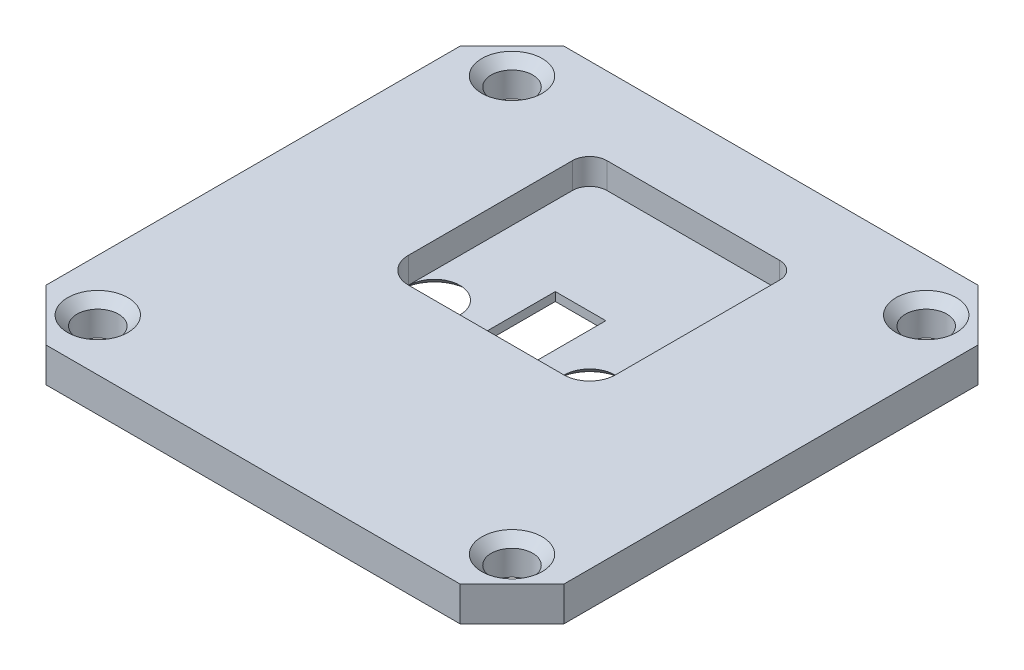
ISO-10303-21;
HEADER;
FILE_DESCRIPTION(('STEP AP214'),'2;1');
FILE_NAME('part.step','',(''),(''),'','','');
FILE_SCHEMA(('AUTOMOTIVE_DESIGN { 1 0 10303 214 1 1 1 1 }'));
ENDSEC;
DATA;
#1=APPLICATION_CONTEXT('core data for automotive mechanical design processes');
#2=APPLICATION_PROTOCOL_DEFINITION('international standard','automotive_design',2000,#1);
#3=PRODUCT_CONTEXT('',#1,'mechanical');
#4=PRODUCT('Part','Part','',(#3));
#5=PRODUCT_RELATED_PRODUCT_CATEGORY('part','',(#4));
#6=PRODUCT_DEFINITION_FORMATION('','',#4);
#7=PRODUCT_DEFINITION_CONTEXT('part definition',#1,'design');
#8=PRODUCT_DEFINITION('design','',#6,#7);
#9=PRODUCT_DEFINITION_SHAPE('','',#8);
#10=(LENGTH_UNIT() NAMED_UNIT(*) SI_UNIT(.MILLI.,.METRE.));
#11=(NAMED_UNIT(*) PLANE_ANGLE_UNIT() SI_UNIT($,.RADIAN.));
#12=(NAMED_UNIT(*) SI_UNIT($,.STERADIAN.) SOLID_ANGLE_UNIT());
#13=UNCERTAINTY_MEASURE_WITH_UNIT(LENGTH_MEASURE(1.E-05),#10,'distance_accuracy_value','');
#14=(GEOMETRIC_REPRESENTATION_CONTEXT(3) GLOBAL_UNCERTAINTY_ASSIGNED_CONTEXT((#13)) GLOBAL_UNIT_ASSIGNED_CONTEXT((#10,
#11,#12)) REPRESENTATION_CONTEXT('',''));
#15=CARTESIAN_POINT('',(0.,0.,0.));
#16=DIRECTION('',(0.,0.,1.));
#17=DIRECTION('',(1.,0.,0.));
#18=AXIS2_PLACEMENT_3D('',#15,#16,#17);
#19=CARTESIAN_POINT('',(0.,2.,0.));
#20=DIRECTION('',(0.,-1.,0.));
#21=DIRECTION('',(0.,0.,-1.));
#22=AXIS2_PLACEMENT_3D('',#19,#20,#21);
#23=PLANE('',#22);
#24=DIRECTION('',(0.,0.,1.));
#25=VECTOR('',#24,1.);
#26=CARTESIAN_POINT('',(-5.29305134511317,2.,-24.2045320216426));
#27=LINE('',#26,#25);
#28=CARTESIAN_POINT('',(-5.29305134511317,2.,-24.2045320216426));
#29=VERTEX_POINT('',#28);
#30=CARTESIAN_POINT('',(-5.29305134511334,2.,-14.7045320216426));
#31=VERTEX_POINT('',#30);
#32=EDGE_CURVE('E237',#29,#31,#27,.T.);
#33=ORIENTED_EDGE('',*,*,#32,.F.);
#34=CARTESIAN_POINT('',(-4.29305134511315,2.,-24.2045320216426));
#35=DIRECTION('',(0.,1.,0.));
#36=DIRECTION('',(0.,0.,-1.));
#37=AXIS2_PLACEMENT_3D('',#34,#35,#36);
#38=CIRCLE('',#37,1.00000000000002);
#39=CARTESIAN_POINT('',(-4.29305134511315,2.,-25.2045320216426));
#40=VERTEX_POINT('',#39);
#41=EDGE_CURVE('E62',#40,#29,#38,.T.);
#42=ORIENTED_EDGE('',*,*,#41,.F.);
#43=DIRECTION('',(-1.,0.,0.));
#44=VECTOR('',#43,1.);
#45=CARTESIAN_POINT('',(-4.29305134511315,2.,-25.2045320216426));
#46=LINE('',#45,#44);
#47=CARTESIAN_POINT('',(5.70694865488684,2.,-25.2045320216424));
#48=VERTEX_POINT('',#47);
#49=EDGE_CURVE('E209',#48,#40,#46,.T.);
#50=ORIENTED_EDGE('',*,*,#49,.F.);
#51=CARTESIAN_POINT('',(5.70694865488667,2.,-24.2045320216423));
#52=DIRECTION('',(0.,1.,0.));
#53=DIRECTION('',(0.,0.,-1.));
#54=AXIS2_PLACEMENT_3D('',#51,#52,#53);
#55=CIRCLE('',#54,1.00000000000016);
#56=CARTESIAN_POINT('',(6.70694865488683,2.,-24.2045320216424));
#57=VERTEX_POINT('',#56);
#58=EDGE_CURVE('E213',#57,#48,#55,.T.);
#59=ORIENTED_EDGE('',*,*,#58,.F.);
#60=DIRECTION('',(0.,0.,-1.));
#61=VECTOR('',#60,1.);
#62=CARTESIAN_POINT('',(6.70694865488683,2.,-24.2045320216424));
#63=LINE('',#62,#61);
#64=CARTESIAN_POINT('',(6.70694865488666,2.,-14.7045320216424));
#65=VERTEX_POINT('',#64);
#66=EDGE_CURVE('E252',#65,#57,#63,.T.);
#67=ORIENTED_EDGE('',*,*,#66,.F.);
#68=CARTESIAN_POINT('',(5.20694865488652,2.,-14.7045320216426));
#69=DIRECTION('',(0.,1.,0.));
#70=DIRECTION('',(0.,0.,1.));
#71=AXIS2_PLACEMENT_3D('',#68,#69,#70);
#72=CIRCLE('',#71,1.50000000000015);
#73=CARTESIAN_POINT('',(5.20694865488663,2.,-13.2045320216424));
#74=VERTEX_POINT('',#73);
#75=EDGE_CURVE('E248',#74,#65,#72,.T.);
#76=ORIENTED_EDGE('',*,*,#75,.F.);
#77=DIRECTION('',(1.,0.,0.));
#78=VECTOR('',#77,1.);
#79=CARTESIAN_POINT('',(-3.79305134511335,2.,-13.2045320216426));
#80=LINE('',#79,#78);
#81=CARTESIAN_POINT('',(-3.79305134511346,2.,-13.2045320216426));
#82=VERTEX_POINT('',#81);
#83=EDGE_CURVE('E244',#82,#74,#80,.T.);
#84=ORIENTED_EDGE('',*,*,#83,.F.);
#85=CARTESIAN_POINT('',(-3.79305134511346,2.,-14.7045320216425));
#86=DIRECTION('',(0.,1.,0.));
#87=DIRECTION('',(0.,0.,1.));
#88=AXIS2_PLACEMENT_3D('',#85,#86,#87);
#89=CIRCLE('',#88,1.49999999999987);
#90=EDGE_CURVE('E240',#31,#82,#89,.T.);
#91=ORIENTED_EDGE('',*,*,#90,.F.);
#92=EDGE_LOOP('',(#33,#42,#50,#59,#67,#76,#84,#91));
#93=FACE_BOUND('',#92,.T.);
#94=CARTESIAN_POINT('',(-11.2930513451133,2.,-26.7045320216426));
#95=DIRECTION('',(0.,1.,0.));
#96=DIRECTION('',(0.,0.,1.));
#97=AXIS2_PLACEMENT_3D('',#94,#95,#96);
#98=CIRCLE('',#97,1.75);
#99=CARTESIAN_POINT('',(-11.2930513451133,2.,-24.9545320216426));
#100=VERTEX_POINT('',#99);
#101=EDGE_CURVE('E302',#100,#100,#98,.T.);
#102=ORIENTED_EDGE('',*,*,#101,.F.);
#103=EDGE_LOOP('',(#102));
#104=FACE_BOUND('',#103,.T.);
#105=CARTESIAN_POINT('',(-11.2930513451133,2.,-2.70453202164257));
#106=DIRECTION('',(0.,1.,0.));
#107=DIRECTION('',(0.,0.,1.));
#108=AXIS2_PLACEMENT_3D('',#105,#106,#107);
#109=CIRCLE('',#108,1.75);
#110=CARTESIAN_POINT('',(-11.2930513451133,2.,-0.954532021642569));
#111=VERTEX_POINT('',#110);
#112=EDGE_CURVE('E311',#111,#111,#109,.T.);
#113=ORIENTED_EDGE('',*,*,#112,.F.);
#114=EDGE_LOOP('',(#113));
#115=FACE_BOUND('',#114,.T.);
#116=CARTESIAN_POINT('',(12.7069486548867,2.,-26.7045320216426));
#117=DIRECTION('',(0.,1.,0.));
#118=DIRECTION('',(0.,0.,1.));
#119=AXIS2_PLACEMENT_3D('',#116,#117,#118);
#120=CIRCLE('',#119,1.75);
#121=CARTESIAN_POINT('',(12.7069486548867,2.,-24.9545320216426));
#122=VERTEX_POINT('',#121);
#123=EDGE_CURVE('E320',#122,#122,#120,.T.);
#124=ORIENTED_EDGE('',*,*,#123,.F.);
#125=EDGE_LOOP('',(#124));
#126=FACE_BOUND('',#125,.T.);
#127=CARTESIAN_POINT('',(12.7069486548867,2.,-2.70453202164257));
#128=DIRECTION('',(0.,1.,0.));
#129=DIRECTION('',(0.,0.,1.));
#130=AXIS2_PLACEMENT_3D('',#127,#128,#129);
#131=CIRCLE('',#130,1.75);
#132=CARTESIAN_POINT('',(12.7069486548867,2.,-0.954532021642568));
#133=VERTEX_POINT('',#132);
#134=EDGE_CURVE('E329',#133,#133,#131,.T.);
#135=ORIENTED_EDGE('',*,*,#134,.F.);
#136=EDGE_LOOP('',(#135));
#137=FACE_BOUND('',#136,.T.);
#138=DIRECTION('',(-0.707106781186547,0.,0.707106781186548));
#139=VECTOR('',#138,1.);
#140=CARTESIAN_POINT('',(-11.2930513451133,2.,-29.7045320216426));
#141=LINE('',#140,#139);
#142=CARTESIAN_POINT('',(-11.2930513451133,2.,-29.7045320216426));
#143=VERTEX_POINT('',#142);
#144=CARTESIAN_POINT('',(-14.2930513451133,2.,-26.7045320216426));
#145=VERTEX_POINT('',#144);
#146=EDGE_CURVE('E367',#143,#145,#141,.T.);
#147=ORIENTED_EDGE('',*,*,#146,.T.);
#148=DIRECTION('',(0.,0.,1.));
#149=VECTOR('',#148,1.);
#150=CARTESIAN_POINT('',(-14.2930513451133,2.,-26.7045320216426));
#151=LINE('',#150,#149);
#152=CARTESIAN_POINT('',(-14.2930513451133,2.,-2.70453202164257));
#153=VERTEX_POINT('',#152);
#154=EDGE_CURVE('E371',#145,#153,#151,.T.);
#155=ORIENTED_EDGE('',*,*,#154,.T.);
#156=DIRECTION('',(0.707106781186548,0.,0.707106781186547));
#157=VECTOR('',#156,1.);
#158=CARTESIAN_POINT('',(-11.2930513451133,2.,0.295467978357432));
#159=LINE('',#158,#157);
#160=CARTESIAN_POINT('',(-11.2930513451133,2.,0.295467978357432));
#161=VERTEX_POINT('',#160);
#162=EDGE_CURVE('E375',#153,#161,#159,.T.);
#163=ORIENTED_EDGE('',*,*,#162,.T.);
#164=DIRECTION('',(1.,0.,0.));
#165=VECTOR('',#164,1.);
#166=CARTESIAN_POINT('',(12.7069486548867,2.,0.29546797835743));
#167=LINE('',#166,#165);
#168=CARTESIAN_POINT('',(12.7069486548867,2.,0.29546797835743));
#169=VERTEX_POINT('',#168);
#170=EDGE_CURVE('E378',#161,#169,#167,.T.);
#171=ORIENTED_EDGE('',*,*,#170,.T.);
#172=DIRECTION('',(0.707106781186548,0.,-0.707106781186547));
#173=VECTOR('',#172,1.);
#174=CARTESIAN_POINT('',(15.7069486548867,2.,-2.70453202164257));
#175=LINE('',#174,#173);
#176=CARTESIAN_POINT('',(15.7069486548867,2.,-2.70453202164257));
#177=VERTEX_POINT('',#176);
#178=EDGE_CURVE('E381',#169,#177,#175,.T.);
#179=ORIENTED_EDGE('',*,*,#178,.T.);
#180=DIRECTION('',(0.,0.,-1.));
#181=VECTOR('',#180,1.);
#182=CARTESIAN_POINT('',(15.7069486548867,2.,-26.7045320216426));
#183=LINE('',#182,#181);
#184=CARTESIAN_POINT('',(15.7069486548867,2.,-26.7045320216426));
#185=VERTEX_POINT('',#184);
#186=EDGE_CURVE('E384',#177,#185,#183,.T.);
#187=ORIENTED_EDGE('',*,*,#186,.T.);
#188=DIRECTION('',(-0.707106781186547,0.,-0.707106781186548));
#189=VECTOR('',#188,1.);
#190=CARTESIAN_POINT('',(12.7069486548867,2.,-29.7045320216426));
#191=LINE('',#190,#189);
#192=CARTESIAN_POINT('',(12.7069486548867,2.,-29.7045320216426));
#193=VERTEX_POINT('',#192);
#194=EDGE_CURVE('E387',#185,#193,#191,.T.);
#195=ORIENTED_EDGE('',*,*,#194,.T.);
#196=DIRECTION('',(-1.,0.,0.));
#197=VECTOR('',#196,1.);
#198=CARTESIAN_POINT('',(-11.2930513451133,2.,-29.7045320216426));
#199=LINE('',#198,#197);
#200=EDGE_CURVE('E390',#193,#143,#199,.T.);
#201=ORIENTED_EDGE('',*,*,#200,.T.);
#202=EDGE_LOOP('',(#147,#155,#163,#171,#179,#187,#195,#201));
#203=FACE_BOUND('',#202,.T.);
#204=ADVANCED_FACE('F44',(#93,#104,#115,#126,#137,#203),#23,.F.);
#205=CARTESIAN_POINT('',(0.,0.,0.));
#206=DIRECTION('',(0.,-1.,0.));
#207=DIRECTION('',(0.,0.,-1.));
#208=AXIS2_PLACEMENT_3D('',#205,#206,#207);
#209=PLANE('',#208);
#210=CARTESIAN_POINT('',(-3.79305134511331,0.,-14.7045320216426));
#211=DIRECTION('',(0.,-1.,0.));
#212=DIRECTION('',(0.,0.,-1.));
#213=AXIS2_PLACEMENT_3D('',#210,#211,#212);
#214=CIRCLE('',#213,2.);
#215=CARTESIAN_POINT('',(-3.79305134511331,0.,-16.7045320216426));
#216=VERTEX_POINT('',#215);
#217=EDGE_CURVE('E294',#216,#216,#214,.T.);
#218=ORIENTED_EDGE('',*,*,#217,.F.);
#219=EDGE_LOOP('',(#218));
#220=FACE_BOUND('',#219,.T.);
#221=CARTESIAN_POINT('',(5.20694865488668,0.,-14.7045320216426));
#222=DIRECTION('',(0.,-1.,0.));
#223=DIRECTION('',(0.,0.,-1.));
#224=AXIS2_PLACEMENT_3D('',#221,#222,#223);
#225=CIRCLE('',#224,2.);
#226=CARTESIAN_POINT('',(5.20694865488668,0.,-16.7045320216426));
#227=VERTEX_POINT('',#226);
#228=EDGE_CURVE('E298',#227,#227,#225,.T.);
#229=ORIENTED_EDGE('',*,*,#228,.F.);
#230=EDGE_LOOP('',(#229));
#231=FACE_BOUND('',#230,.T.);
#232=CARTESIAN_POINT('',(-11.2930513451133,0.,-26.7045320216426));
#233=DIRECTION('',(0.,-1.,0.));
#234=DIRECTION('',(0.,0.,-1.));
#235=AXIS2_PLACEMENT_3D('',#232,#233,#234);
#236=CIRCLE('',#235,1.19999999999999);
#237=CARTESIAN_POINT('',(-11.2930513451133,0.,-27.9045320216426));
#238=VERTEX_POINT('',#237);
#239=EDGE_CURVE('E310',#238,#238,#236,.T.);
#240=ORIENTED_EDGE('',*,*,#239,.F.);
#241=EDGE_LOOP('',(#240));
#242=FACE_BOUND('',#241,.T.);
#243=CARTESIAN_POINT('',(-11.2930513451133,0.,-2.70453202164257));
#244=DIRECTION('',(0.,-1.,0.));
#245=DIRECTION('',(0.,0.,-1.));
#246=AXIS2_PLACEMENT_3D('',#243,#244,#245);
#247=CIRCLE('',#246,1.19999999999999);
#248=CARTESIAN_POINT('',(-11.2930513451133,0.,-3.90453202164256));
#249=VERTEX_POINT('',#248);
#250=EDGE_CURVE('E319',#249,#249,#247,.T.);
#251=ORIENTED_EDGE('',*,*,#250,.F.);
#252=EDGE_LOOP('',(#251));
#253=FACE_BOUND('',#252,.T.);
#254=CARTESIAN_POINT('',(12.7069486548867,0.,-26.7045320216426));
#255=DIRECTION('',(0.,-1.,0.));
#256=DIRECTION('',(0.,0.,-1.));
#257=AXIS2_PLACEMENT_3D('',#254,#255,#256);
#258=CIRCLE('',#257,1.19999999999999);
#259=CARTESIAN_POINT('',(12.7069486548867,0.,-27.9045320216426));
#260=VERTEX_POINT('',#259);
#261=EDGE_CURVE('E328',#260,#260,#258,.T.);
#262=ORIENTED_EDGE('',*,*,#261,.F.);
#263=EDGE_LOOP('',(#262));
#264=FACE_BOUND('',#263,.T.);
#265=CARTESIAN_POINT('',(12.7069486548867,0.,-2.70453202164257));
#266=DIRECTION('',(0.,-1.,0.));
#267=DIRECTION('',(0.,0.,-1.));
#268=AXIS2_PLACEMENT_3D('',#265,#266,#267);
#269=CIRCLE('',#268,1.19999999999999);
#270=CARTESIAN_POINT('',(12.7069486548867,0.,-3.90453202164256));
#271=VERTEX_POINT('',#270);
#272=EDGE_CURVE('E337',#271,#271,#269,.T.);
#273=ORIENTED_EDGE('',*,*,#272,.F.);
#274=EDGE_LOOP('',(#273));
#275=FACE_BOUND('',#274,.T.);
#276=DIRECTION('',(-0.707106781186547,0.,0.707106781186548));
#277=VECTOR('',#276,1.);
#278=CARTESIAN_POINT('',(-11.2930513451133,0.,-29.7045320216426));
#279=LINE('',#278,#277);
#280=CARTESIAN_POINT('',(-11.2930513451133,0.,-29.7045320216426));
#281=VERTEX_POINT('',#280);
#282=CARTESIAN_POINT('',(-14.2930513451133,0.,-26.7045320216426));
#283=VERTEX_POINT('',#282);
#284=EDGE_CURVE('E366',#281,#283,#279,.T.);
#285=ORIENTED_EDGE('',*,*,#284,.F.);
#286=DIRECTION('',(-1.,0.,0.));
#287=VECTOR('',#286,1.);
#288=CARTESIAN_POINT('',(-11.2930513451133,0.,-29.7045320216426));
#289=LINE('',#288,#287);
#290=CARTESIAN_POINT('',(12.7069486548867,0.,-29.7045320216426));
#291=VERTEX_POINT('',#290);
#292=EDGE_CURVE('E372',#291,#281,#289,.T.);
#293=ORIENTED_EDGE('',*,*,#292,.F.);
#294=DIRECTION('',(-0.707106781186547,0.,-0.707106781186548));
#295=VECTOR('',#294,1.);
#296=CARTESIAN_POINT('',(12.7069486548867,0.,-29.7045320216426));
#297=LINE('',#296,#295);
#298=CARTESIAN_POINT('',(15.7069486548867,0.,-26.7045320216426));
#299=VERTEX_POINT('',#298);
#300=EDGE_CURVE('E412',#299,#291,#297,.T.);
#301=ORIENTED_EDGE('',*,*,#300,.F.);
#302=DIRECTION('',(0.,0.,-1.));
#303=VECTOR('',#302,1.);
#304=CARTESIAN_POINT('',(15.7069486548867,0.,-26.7045320216426));
#305=LINE('',#304,#303);
#306=CARTESIAN_POINT('',(15.7069486548867,0.,-2.70453202164257));
#307=VERTEX_POINT('',#306);
#308=EDGE_CURVE('E409',#307,#299,#305,.T.);
#309=ORIENTED_EDGE('',*,*,#308,.F.);
#310=DIRECTION('',(0.707106781186548,0.,-0.707106781186547));
#311=VECTOR('',#310,1.);
#312=CARTESIAN_POINT('',(15.7069486548867,0.,-2.70453202164257));
#313=LINE('',#312,#311);
#314=CARTESIAN_POINT('',(12.7069486548867,0.,0.29546797835743));
#315=VERTEX_POINT('',#314);
#316=EDGE_CURVE('E406',#315,#307,#313,.T.);
#317=ORIENTED_EDGE('',*,*,#316,.F.);
#318=DIRECTION('',(1.,0.,0.));
#319=VECTOR('',#318,1.);
#320=CARTESIAN_POINT('',(12.7069486548867,0.,0.29546797835743));
#321=LINE('',#320,#319);
#322=CARTESIAN_POINT('',(-11.2930513451133,0.,0.295467978357432));
#323=VERTEX_POINT('',#322);
#324=EDGE_CURVE('E403',#323,#315,#321,.T.);
#325=ORIENTED_EDGE('',*,*,#324,.F.);
#326=DIRECTION('',(0.707106781186548,0.,0.707106781186547));
#327=VECTOR('',#326,1.);
#328=CARTESIAN_POINT('',(-11.2930513451133,0.,0.295467978357432));
#329=LINE('',#328,#327);
#330=CARTESIAN_POINT('',(-14.2930513451133,0.,-2.70453202164257));
#331=VERTEX_POINT('',#330);
#332=EDGE_CURVE('E400',#331,#323,#329,.T.);
#333=ORIENTED_EDGE('',*,*,#332,.F.);
#334=DIRECTION('',(0.,0.,1.));
#335=VECTOR('',#334,1.);
#336=CARTESIAN_POINT('',(-14.2930513451133,0.,-26.7045320216426));
#337=LINE('',#336,#335);
#338=EDGE_CURVE('E397',#283,#331,#337,.T.);
#339=ORIENTED_EDGE('',*,*,#338,.F.);
#340=EDGE_LOOP('',(#285,#293,#301,#309,#317,#325,#333,#339));
#341=FACE_BOUND('',#340,.T.);
#342=DIRECTION('',(1.,0.,0.));
#343=VECTOR('',#342,1.);
#344=CARTESIAN_POINT('',(2.20694865485505,0.,-13.7386259345704));
#345=LINE('',#344,#343);
#346=CARTESIAN_POINT('',(-0.719016852574472,0.,-13.7386259345704));
#347=VERTEX_POINT('',#346);
#348=CARTESIAN_POINT('',(2.20694865485505,0.,-13.7386259345704));
#349=VERTEX_POINT('',#348);
#350=EDGE_CURVE('E350',#347,#349,#345,.T.);
#351=ORIENTED_EDGE('',*,*,#350,.T.);
#352=DIRECTION('',(0.,0.,-1.));
#353=VECTOR('',#352,1.);
#354=CARTESIAN_POINT('',(2.20694865485505,0.,-18.6402059411357));
#355=LINE('',#354,#353);
#356=CARTESIAN_POINT('',(2.20694865485505,0.,-18.6402059411357));
#357=VERTEX_POINT('',#356);
#358=EDGE_CURVE('E338',#349,#357,#355,.T.);
#359=ORIENTED_EDGE('',*,*,#358,.T.);
#360=DIRECTION('',(-1.,0.,0.));
#361=VECTOR('',#360,1.);
#362=CARTESIAN_POINT('',(2.20694865485505,0.,-18.6402059411357));
#363=LINE('',#362,#361);
#364=CARTESIAN_POINT('',(-0.719016852574472,0.,-18.6402059411357));
#365=VERTEX_POINT('',#364);
#366=EDGE_CURVE('E342',#357,#365,#363,.T.);
#367=ORIENTED_EDGE('',*,*,#366,.T.);
#368=DIRECTION('',(0.,0.,1.));
#369=VECTOR('',#368,1.);
#370=CARTESIAN_POINT('',(-0.719016852574472,0.,-18.6402059411357));
#371=LINE('',#370,#369);
#372=EDGE_CURVE('E346',#365,#347,#371,.T.);
#373=ORIENTED_EDGE('',*,*,#372,.T.);
#374=EDGE_LOOP('',(#351,#359,#367,#373));
#375=FACE_BOUND('',#374,.T.);
#376=ADVANCED_FACE('F458',(#220,#231,#242,#253,#264,#275,#341,#375),#209,.T.);
#377=CARTESIAN_POINT('',(-11.2930513451133,2.,-29.7045320216426));
#378=DIRECTION('',(0.707106781186548,0.,0.707106781186547));
#379=DIRECTION('',(0.707106781186547,0.,-0.707106781186548));
#380=AXIS2_PLACEMENT_3D('',#377,#378,#379);
#381=PLANE('',#380);
#382=ORIENTED_EDGE('',*,*,#284,.T.);
#383=DIRECTION('',(0.,-1.,0.));
#384=VECTOR('',#383,1.);
#385=CARTESIAN_POINT('',(-14.2930513451133,2.,-26.7045320216426));
#386=LINE('',#385,#384);
#387=EDGE_CURVE('E11',#145,#283,#386,.T.);
#388=ORIENTED_EDGE('',*,*,#387,.F.);
#389=ORIENTED_EDGE('',*,*,#146,.F.);
#390=DIRECTION('',(0.,-1.,0.));
#391=VECTOR('',#390,1.);
#392=CARTESIAN_POINT('',(-11.2930513451133,2.,-29.7045320216426));
#393=LINE('',#392,#391);
#394=EDGE_CURVE('E393',#143,#281,#393,.T.);
#395=ORIENTED_EDGE('',*,*,#394,.T.);
#396=EDGE_LOOP('',(#382,#388,#389,#395));
#397=FACE_BOUND('',#396,.T.);
#398=ADVANCED_FACE('F46',(#397),#381,.F.);
#399=CARTESIAN_POINT('',(-14.2930513451133,2.,-26.7045320216426));
#400=DIRECTION('',(1.,0.,0.));
#401=DIRECTION('',(0.,0.,-1.));
#402=AXIS2_PLACEMENT_3D('',#399,#400,#401);
#403=PLANE('',#402);
#404=ORIENTED_EDGE('',*,*,#338,.T.);
#405=DIRECTION('',(0.,-1.,0.));
#406=VECTOR('',#405,1.);
#407=CARTESIAN_POINT('',(-14.2930513451133,2.,-2.70453202164257));
#408=LINE('',#407,#406);
#409=EDGE_CURVE('E54',#153,#331,#408,.T.);
#410=ORIENTED_EDGE('',*,*,#409,.F.);
#411=ORIENTED_EDGE('',*,*,#154,.F.);
#412=ORIENTED_EDGE('',*,*,#387,.T.);
#413=EDGE_LOOP('',(#404,#410,#411,#412));
#414=FACE_BOUND('',#413,.T.);
#415=ADVANCED_FACE('F548',(#414),#403,.F.);
#416=CARTESIAN_POINT('',(-11.2930513451133,2.,0.295467978357432));
#417=DIRECTION('',(0.707106781186547,0.,-0.707106781186548));
#418=DIRECTION('',(-0.707106781186548,0.,-0.707106781186547));
#419=AXIS2_PLACEMENT_3D('',#416,#417,#418);
#420=PLANE('',#419);
#421=ORIENTED_EDGE('',*,*,#332,.T.);
#422=DIRECTION('',(0.,-1.,0.));
#423=VECTOR('',#422,1.);
#424=CARTESIAN_POINT('',(-11.2930513451133,2.,0.295467978357432));
#425=LINE('',#424,#423);
#426=EDGE_CURVE('E436',#161,#323,#425,.T.);
#427=ORIENTED_EDGE('',*,*,#426,.F.);
#428=ORIENTED_EDGE('',*,*,#162,.F.);
#429=ORIENTED_EDGE('',*,*,#409,.T.);
#430=EDGE_LOOP('',(#421,#427,#428,#429));
#431=FACE_BOUND('',#430,.T.);
#432=ADVANCED_FACE('F545',(#431),#420,.F.);
#433=CARTESIAN_POINT('',(12.7069486548867,2.,0.29546797835743));
#434=DIRECTION('',(0.,0.,-1.));
#435=DIRECTION('',(-1.,0.,0.));
#436=AXIS2_PLACEMENT_3D('',#433,#434,#435);
#437=PLANE('',#436);
#438=ORIENTED_EDGE('',*,*,#324,.T.);
#439=DIRECTION('',(0.,-1.,0.));
#440=VECTOR('',#439,1.);
#441=CARTESIAN_POINT('',(12.7069486548867,2.,0.29546797835743));
#442=LINE('',#441,#440);
#443=EDGE_CURVE('E432',#169,#315,#442,.T.);
#444=ORIENTED_EDGE('',*,*,#443,.F.);
#445=ORIENTED_EDGE('',*,*,#170,.F.);
#446=ORIENTED_EDGE('',*,*,#426,.T.);
#447=EDGE_LOOP('',(#438,#444,#445,#446));
#448=FACE_BOUND('',#447,.T.);
#449=ADVANCED_FACE('F541',(#448),#437,.F.);
#450=CARTESIAN_POINT('',(15.7069486548867,2.,-2.70453202164257));
#451=DIRECTION('',(-0.707106781186547,0.,-0.707106781186548));
#452=DIRECTION('',(-0.707106781186548,0.,0.707106781186547));
#453=AXIS2_PLACEMENT_3D('',#450,#451,#452);
#454=PLANE('',#453);
#455=ORIENTED_EDGE('',*,*,#316,.T.);
#456=DIRECTION('',(0.,-1.,0.));
#457=VECTOR('',#456,1.);
#458=CARTESIAN_POINT('',(15.7069486548867,2.,-2.70453202164257));
#459=LINE('',#458,#457);
#460=EDGE_CURVE('E428',#177,#307,#459,.T.);
#461=ORIENTED_EDGE('',*,*,#460,.F.);
#462=ORIENTED_EDGE('',*,*,#178,.F.);
#463=ORIENTED_EDGE('',*,*,#443,.T.);
#464=EDGE_LOOP('',(#455,#461,#462,#463));
#465=FACE_BOUND('',#464,.T.);
#466=ADVANCED_FACE('F537',(#465),#454,.F.);
#467=CARTESIAN_POINT('',(15.7069486548867,2.,-26.7045320216426));
#468=DIRECTION('',(-1.,0.,0.));
#469=DIRECTION('',(0.,0.,1.));
#470=AXIS2_PLACEMENT_3D('',#467,#468,#469);
#471=PLANE('',#470);
#472=ORIENTED_EDGE('',*,*,#308,.T.);
#473=DIRECTION('',(0.,-1.,0.));
#474=VECTOR('',#473,1.);
#475=CARTESIAN_POINT('',(15.7069486548867,2.,-26.7045320216426));
#476=LINE('',#475,#474);
#477=EDGE_CURVE('E424',#185,#299,#476,.T.);
#478=ORIENTED_EDGE('',*,*,#477,.F.);
#479=ORIENTED_EDGE('',*,*,#186,.F.);
#480=ORIENTED_EDGE('',*,*,#460,.T.);
#481=EDGE_LOOP('',(#472,#478,#479,#480));
#482=FACE_BOUND('',#481,.T.);
#483=ADVANCED_FACE('F533',(#482),#471,.F.);
#484=CARTESIAN_POINT('',(12.7069486548867,2.,-29.7045320216426));
#485=DIRECTION('',(-0.707106781186548,0.,0.707106781186547));
#486=DIRECTION('',(0.707106781186547,0.,0.707106781186548));
#487=AXIS2_PLACEMENT_3D('',#484,#485,#486);
#488=PLANE('',#487);
#489=ORIENTED_EDGE('',*,*,#300,.T.);
#490=DIRECTION('',(0.,-1.,0.));
#491=VECTOR('',#490,1.);
#492=CARTESIAN_POINT('',(12.7069486548867,2.,-29.7045320216426));
#493=LINE('',#492,#491);
#494=EDGE_CURVE('E420',#193,#291,#493,.T.);
#495=ORIENTED_EDGE('',*,*,#494,.F.);
#496=ORIENTED_EDGE('',*,*,#194,.F.);
#497=ORIENTED_EDGE('',*,*,#477,.T.);
#498=EDGE_LOOP('',(#489,#495,#496,#497));
#499=FACE_BOUND('',#498,.T.);
#500=ADVANCED_FACE('F529',(#499),#488,.F.);
#501=CARTESIAN_POINT('',(-11.2930513451133,2.,-29.7045320216426));
#502=DIRECTION('',(0.,0.,1.));
#503=DIRECTION('',(1.,0.,0.));
#504=AXIS2_PLACEMENT_3D('',#501,#502,#503);
#505=PLANE('',#504);
#506=ORIENTED_EDGE('',*,*,#292,.T.);
#507=ORIENTED_EDGE('',*,*,#394,.F.);
#508=ORIENTED_EDGE('',*,*,#200,.F.);
#509=ORIENTED_EDGE('',*,*,#494,.T.);
#510=EDGE_LOOP('',(#506,#507,#508,#509));
#511=FACE_BOUND('',#510,.T.);
#512=ADVANCED_FACE('F526',(#511),#505,.F.);
#513=CARTESIAN_POINT('',(2.20694865485505,2.,-18.6402059411357));
#514=DIRECTION('',(-1.,0.,0.));
#515=DIRECTION('',(0.,0.,1.));
#516=AXIS2_PLACEMENT_3D('',#513,#514,#515);
#517=PLANE('',#516);
#518=DIRECTION('',(0.,0.,1.));
#519=VECTOR('',#518,1.);
#520=CARTESIAN_POINT('',(2.20694865485505,0.5,-18.6402059411357));
#521=LINE('',#520,#519);
#522=CARTESIAN_POINT('',(2.20694865485505,0.5,-18.6402059411357));
#523=VERTEX_POINT('',#522);
#524=CARTESIAN_POINT('',(2.20694865485505,0.5,-13.7386259345704));
#525=VERTEX_POINT('',#524);
#526=EDGE_CURVE('E70',#523,#525,#521,.T.);
#527=ORIENTED_EDGE('',*,*,#526,.F.);
#528=DIRECTION('',(0.,-1.,0.));
#529=VECTOR('',#528,1.);
#530=CARTESIAN_POINT('',(2.20694865485505,2.,-18.6402059411357));
#531=LINE('',#530,#529);
#532=EDGE_CURVE('E363',#523,#357,#531,.T.);
#533=ORIENTED_EDGE('',*,*,#532,.T.);
#534=ORIENTED_EDGE('',*,*,#358,.F.);
#535=DIRECTION('',(0.,-1.,0.));
#536=VECTOR('',#535,1.);
#537=CARTESIAN_POINT('',(2.20694865485505,2.,-13.7386259345704));
#538=LINE('',#537,#536);
#539=EDGE_CURVE('E354',#525,#349,#538,.T.);
#540=ORIENTED_EDGE('',*,*,#539,.F.);
#541=EDGE_LOOP('',(#527,#533,#534,#540));
#542=FACE_BOUND('',#541,.T.);
#543=ADVANCED_FACE('F480',(#542),#517,.T.);
#544=CARTESIAN_POINT('',(2.20694865485505,2.,-18.6402059411357));
#545=DIRECTION('',(0.,0.,1.));
#546=DIRECTION('',(1.,0.,0.));
#547=AXIS2_PLACEMENT_3D('',#544,#545,#546);
#548=PLANE('',#547);
#549=DIRECTION('',(1.,0.,0.));
#550=VECTOR('',#549,1.);
#551=CARTESIAN_POINT('',(2.20694865485505,0.5,-18.6402059411357));
#552=LINE('',#551,#550);
#553=CARTESIAN_POINT('',(-0.719016852574472,0.5,-18.6402059411357));
#554=VERTEX_POINT('',#553);
#555=EDGE_CURVE('E289',#554,#523,#552,.T.);
#556=ORIENTED_EDGE('',*,*,#555,.F.);
#557=DIRECTION('',(0.,-1.,0.));
#558=VECTOR('',#557,1.);
#559=CARTESIAN_POINT('',(-0.719016852574472,2.,-18.6402059411357));
#560=LINE('',#559,#558);
#561=EDGE_CURVE('E360',#554,#365,#560,.T.);
#562=ORIENTED_EDGE('',*,*,#561,.T.);
#563=ORIENTED_EDGE('',*,*,#366,.F.);
#564=ORIENTED_EDGE('',*,*,#532,.F.);
#565=EDGE_LOOP('',(#556,#562,#563,#564));
#566=FACE_BOUND('',#565,.T.);
#567=ADVANCED_FACE('F485',(#566),#548,.T.);
#568=CARTESIAN_POINT('',(-0.719016852574472,2.,-18.6402059411357));
#569=DIRECTION('',(1.,0.,0.));
#570=DIRECTION('',(0.,0.,-1.));
#571=AXIS2_PLACEMENT_3D('',#568,#569,#570);
#572=PLANE('',#571);
#573=DIRECTION('',(0.,0.,-1.));
#574=VECTOR('',#573,1.);
#575=CARTESIAN_POINT('',(-0.719016852574472,0.5,-18.6402059411357));
#576=LINE('',#575,#574);
#577=CARTESIAN_POINT('',(-0.719016852574472,0.5,-13.7386259345704));
#578=VERTEX_POINT('',#577);
#579=EDGE_CURVE('E286',#578,#554,#576,.T.);
#580=ORIENTED_EDGE('',*,*,#579,.F.);
#581=DIRECTION('',(0.,-1.,0.));
#582=VECTOR('',#581,1.);
#583=CARTESIAN_POINT('',(-0.719016852574472,2.,-13.7386259345704));
#584=LINE('',#583,#582);
#585=EDGE_CURVE('E357',#578,#347,#584,.T.);
#586=ORIENTED_EDGE('',*,*,#585,.T.);
#587=ORIENTED_EDGE('',*,*,#372,.F.);
#588=ORIENTED_EDGE('',*,*,#561,.F.);
#589=EDGE_LOOP('',(#580,#586,#587,#588));
#590=FACE_BOUND('',#589,.T.);
#591=ADVANCED_FACE('F489',(#590),#572,.T.);
#592=CARTESIAN_POINT('',(2.20694865485505,2.,-13.7386259345704));
#593=DIRECTION('',(0.,0.,-1.));
#594=DIRECTION('',(-1.,0.,0.));
#595=AXIS2_PLACEMENT_3D('',#592,#593,#594);
#596=PLANE('',#595);
#597=DIRECTION('',(-1.,0.,0.));
#598=VECTOR('',#597,1.);
#599=CARTESIAN_POINT('',(2.20694865485505,0.5,-13.7386259345704));
#600=LINE('',#599,#598);
#601=EDGE_CURVE('E283',#525,#578,#600,.T.);
#602=ORIENTED_EDGE('',*,*,#601,.F.);
#603=ORIENTED_EDGE('',*,*,#539,.T.);
#604=ORIENTED_EDGE('',*,*,#350,.F.);
#605=ORIENTED_EDGE('',*,*,#585,.F.);
#606=EDGE_LOOP('',(#602,#603,#604,#605));
#607=FACE_BOUND('',#606,.T.);
#608=ADVANCED_FACE('F477',(#607),#596,.T.);
#609=CARTESIAN_POINT('',(12.7069486548867,2.,-2.70453202164257));
#610=DIRECTION('',(0.,1.,0.));
#611=DIRECTION('',(0.,0.,1.));
#612=AXIS2_PLACEMENT_3D('',#609,#610,#611);
#613=CYLINDRICAL_SURFACE('',#612,1.19999999999999);
#614=ORIENTED_EDGE('',*,*,#272,.T.);
#615=EDGE_LOOP('',(#614));
#616=FACE_BOUND('',#615,.T.);
#617=CARTESIAN_POINT('',(12.7069486548867,1.44999999999999,-2.70453202164257));
#618=DIRECTION('',(0.,1.,0.));
#619=DIRECTION('',(0.,0.,1.));
#620=AXIS2_PLACEMENT_3D('',#617,#618,#619);
#621=CIRCLE('',#620,1.19999999999999);
#622=CARTESIAN_POINT('',(12.7069486548867,1.44999999999999,-1.50453202164257));
#623=VERTEX_POINT('',#622);
#624=EDGE_CURVE('E333',#623,#623,#621,.T.);
#625=ORIENTED_EDGE('',*,*,#624,.T.);
#626=EDGE_LOOP('',(#625));
#627=FACE_BOUND('',#626,.T.);
#628=ADVANCED_FACE('F654',(#616,#627),#613,.F.);
#629=CARTESIAN_POINT('',(12.7069486548867,2.,-2.70453202164257));
#630=DIRECTION('',(0.,1.,0.));
#631=DIRECTION('',(0.,0.,1.));
#632=AXIS2_PLACEMENT_3D('',#629,#630,#631);
#633=CONICAL_SURFACE('',#632,1.75,0.785398163397445);
#634=ORIENTED_EDGE('',*,*,#624,.F.);
#635=EDGE_LOOP('',(#634));
#636=FACE_BOUND('',#635,.T.);
#637=ORIENTED_EDGE('',*,*,#134,.T.);
#638=EDGE_LOOP('',(#637));
#639=FACE_BOUND('',#638,.T.);
#640=ADVANCED_FACE('F662',(#636,#639),#633,.F.);
#641=CARTESIAN_POINT('',(12.7069486548867,2.,-26.7045320216426));
#642=DIRECTION('',(0.,1.,0.));
#643=DIRECTION('',(0.,0.,1.));
#644=AXIS2_PLACEMENT_3D('',#641,#642,#643);
#645=CYLINDRICAL_SURFACE('',#644,1.19999999999999);
#646=ORIENTED_EDGE('',*,*,#261,.T.);
#647=EDGE_LOOP('',(#646));
#648=FACE_BOUND('',#647,.T.);
#649=CARTESIAN_POINT('',(12.7069486548867,1.44999999999999,-26.7045320216426));
#650=DIRECTION('',(0.,1.,0.));
#651=DIRECTION('',(0.,0.,1.));
#652=AXIS2_PLACEMENT_3D('',#649,#650,#651);
#653=CIRCLE('',#652,1.19999999999999);
#654=CARTESIAN_POINT('',(12.7069486548867,1.44999999999999,-25.5045320216426));
#655=VERTEX_POINT('',#654);
#656=EDGE_CURVE('E324',#655,#655,#653,.T.);
#657=ORIENTED_EDGE('',*,*,#656,.T.);
#658=EDGE_LOOP('',(#657));
#659=FACE_BOUND('',#658,.T.);
#660=ADVANCED_FACE('F672',(#648,#659),#645,.F.);
#661=CARTESIAN_POINT('',(12.7069486548867,2.,-26.7045320216426));
#662=DIRECTION('',(0.,1.,0.));
#663=DIRECTION('',(0.,0.,1.));
#664=AXIS2_PLACEMENT_3D('',#661,#662,#663);
#665=CONICAL_SURFACE('',#664,1.75,0.785398163397445);
#666=ORIENTED_EDGE('',*,*,#656,.F.);
#667=EDGE_LOOP('',(#666));
#668=FACE_BOUND('',#667,.T.);
#669=ORIENTED_EDGE('',*,*,#123,.T.);
#670=EDGE_LOOP('',(#669));
#671=FACE_BOUND('',#670,.T.);
#672=ADVANCED_FACE('F682',(#668,#671),#665,.F.);
#673=CARTESIAN_POINT('',(-11.2930513451133,2.,-2.70453202164257));
#674=DIRECTION('',(0.,1.,0.));
#675=DIRECTION('',(0.,0.,1.));
#676=AXIS2_PLACEMENT_3D('',#673,#674,#675);
#677=CYLINDRICAL_SURFACE('',#676,1.19999999999999);
#678=ORIENTED_EDGE('',*,*,#250,.T.);
#679=EDGE_LOOP('',(#678));
#680=FACE_BOUND('',#679,.T.);
#681=CARTESIAN_POINT('',(-11.2930513451133,1.44999999999999,-2.70453202164257));
#682=DIRECTION('',(0.,1.,0.));
#683=DIRECTION('',(0.,0.,1.));
#684=AXIS2_PLACEMENT_3D('',#681,#682,#683);
#685=CIRCLE('',#684,1.19999999999999);
#686=CARTESIAN_POINT('',(-11.2930513451133,1.44999999999999,-1.50453202164257));
#687=VERTEX_POINT('',#686);
#688=EDGE_CURVE('E315',#687,#687,#685,.T.);
#689=ORIENTED_EDGE('',*,*,#688,.T.);
#690=EDGE_LOOP('',(#689));
#691=FACE_BOUND('',#690,.T.);
#692=ADVANCED_FACE('F692',(#680,#691),#677,.F.);
#693=CARTESIAN_POINT('',(-11.2930513451133,2.,-2.70453202164257));
#694=DIRECTION('',(0.,1.,0.));
#695=DIRECTION('',(0.,0.,1.));
#696=AXIS2_PLACEMENT_3D('',#693,#694,#695);
#697=CONICAL_SURFACE('',#696,1.75,0.785398163397445);
#698=ORIENTED_EDGE('',*,*,#688,.F.);
#699=EDGE_LOOP('',(#698));
#700=FACE_BOUND('',#699,.T.);
#701=ORIENTED_EDGE('',*,*,#112,.T.);
#702=EDGE_LOOP('',(#701));
#703=FACE_BOUND('',#702,.T.);
#704=ADVANCED_FACE('F702',(#700,#703),#697,.F.);
#705=CARTESIAN_POINT('',(-11.2930513451133,2.,-26.7045320216426));
#706=DIRECTION('',(0.,1.,0.));
#707=DIRECTION('',(0.,0.,1.));
#708=AXIS2_PLACEMENT_3D('',#705,#706,#707);
#709=CYLINDRICAL_SURFACE('',#708,1.19999999999999);
#710=ORIENTED_EDGE('',*,*,#239,.T.);
#711=EDGE_LOOP('',(#710));
#712=FACE_BOUND('',#711,.T.);
#713=CARTESIAN_POINT('',(-11.2930513451133,1.44999999999999,-26.7045320216426));
#714=DIRECTION('',(0.,1.,0.));
#715=DIRECTION('',(0.,0.,1.));
#716=AXIS2_PLACEMENT_3D('',#713,#714,#715);
#717=CIRCLE('',#716,1.19999999999999);
#718=CARTESIAN_POINT('',(-11.2930513451133,1.44999999999999,-25.5045320216426));
#719=VERTEX_POINT('',#718);
#720=EDGE_CURVE('E306',#719,#719,#717,.T.);
#721=ORIENTED_EDGE('',*,*,#720,.T.);
#722=EDGE_LOOP('',(#721));
#723=FACE_BOUND('',#722,.T.);
#724=ADVANCED_FACE('F455',(#712,#723),#709,.F.);
#725=CARTESIAN_POINT('',(-11.2930513451133,2.,-26.7045320216426));
#726=DIRECTION('',(0.,1.,0.));
#727=DIRECTION('',(0.,0.,1.));
#728=AXIS2_PLACEMENT_3D('',#725,#726,#727);
#729=CONICAL_SURFACE('',#728,1.75,0.785398163397445);
#730=ORIENTED_EDGE('',*,*,#720,.F.);
#731=EDGE_LOOP('',(#730));
#732=FACE_BOUND('',#731,.T.);
#733=ORIENTED_EDGE('',*,*,#101,.T.);
#734=EDGE_LOOP('',(#733));
#735=FACE_BOUND('',#734,.T.);
#736=ADVANCED_FACE('F507',(#732,#735),#729,.F.);
#737=CARTESIAN_POINT('',(5.20694865488668,0.,-14.7045320216426));
#738=DIRECTION('',(0.,-1.,0.));
#739=DIRECTION('',(0.,0.,-1.));
#740=AXIS2_PLACEMENT_3D('',#737,#738,#739);
#741=CONICAL_SURFACE('',#740,2.,0.802851455917391);
#742=CARTESIAN_POINT('',(5.20694865488668,0.5,-14.7045320216426));
#743=DIRECTION('',(0.,-1.,0.));
#744=DIRECTION('',(0.,0.,-1.));
#745=AXIS2_PLACEMENT_3D('',#742,#743,#744);
#746=CIRCLE('',#745,1.48223484310472);
#747=CARTESIAN_POINT('',(5.20694865488668,0.5,-16.1867668647473));
#748=VERTEX_POINT('',#747);
#749=EDGE_CURVE('E279',#748,#748,#746,.F.);
#750=ORIENTED_EDGE('',*,*,#749,.T.);
#751=EDGE_LOOP('',(#750));
#752=FACE_BOUND('',#751,.T.);
#753=ORIENTED_EDGE('',*,*,#228,.T.);
#754=EDGE_LOOP('',(#753));
#755=FACE_BOUND('',#754,.T.);
#756=ADVANCED_FACE('F500',(#752,#755),#741,.F.);
#757=CARTESIAN_POINT('',(-3.79305134511331,0.,-14.7045320216426));
#758=DIRECTION('',(0.,-1.,0.));
#759=DIRECTION('',(0.,0.,-1.));
#760=AXIS2_PLACEMENT_3D('',#757,#758,#759);
#761=CONICAL_SURFACE('',#760,2.,0.802851455917391);
#762=CARTESIAN_POINT('',(-3.79305134511331,0.5,-14.7045320216426));
#763=DIRECTION('',(0.,-1.,0.));
#764=DIRECTION('',(0.,0.,-1.));
#765=AXIS2_PLACEMENT_3D('',#762,#763,#764);
#766=CIRCLE('',#765,1.48223484310472);
#767=CARTESIAN_POINT('',(-3.79305134511331,0.5,-16.1867668647473));
#768=VERTEX_POINT('',#767);
#769=EDGE_CURVE('E48',#768,#768,#766,.F.);
#770=ORIENTED_EDGE('',*,*,#769,.T.);
#771=EDGE_LOOP('',(#770));
#772=FACE_BOUND('',#771,.T.);
#773=ORIENTED_EDGE('',*,*,#217,.T.);
#774=EDGE_LOOP('',(#773));
#775=FACE_BOUND('',#774,.T.);
#776=ADVANCED_FACE('F492',(#772,#775),#761,.F.);
#777=CARTESIAN_POINT('',(-4.29305134511315,0.5,-24.2045320216426));
#778=DIRECTION('',(0.,-1.,0.));
#779=DIRECTION('',(0.,0.,-1.));
#780=AXIS2_PLACEMENT_3D('',#777,#778,#779);
#781=PLANE('',#780);
#782=ORIENTED_EDGE('',*,*,#526,.T.);
#783=ORIENTED_EDGE('',*,*,#601,.T.);
#784=ORIENTED_EDGE('',*,*,#579,.T.);
#785=ORIENTED_EDGE('',*,*,#555,.T.);
#786=EDGE_LOOP('',(#782,#783,#784,#785));
#787=FACE_BOUND('',#786,.T.);
#788=ORIENTED_EDGE('',*,*,#769,.F.);
#789=EDGE_LOOP('',(#788));
#790=FACE_BOUND('',#789,.T.);
#791=CARTESIAN_POINT('',(-4.29305134511315,0.5,-24.2045320216426));
#792=DIRECTION('',(0.,1.,0.));
#793=DIRECTION('',(0.,0.,-1.));
#794=AXIS2_PLACEMENT_3D('',#791,#792,#793);
#795=CIRCLE('',#794,1.00000000000002);
#796=CARTESIAN_POINT('',(-4.29305134511315,0.5,-25.2045320216426));
#797=VERTEX_POINT('',#796);
#798=CARTESIAN_POINT('',(-5.29305134511317,0.5,-24.2045320216426));
#799=VERTEX_POINT('',#798);
#800=EDGE_CURVE('E186',#797,#799,#795,.T.);
#801=ORIENTED_EDGE('',*,*,#800,.T.);
#802=DIRECTION('',(0.,0.,1.));
#803=VECTOR('',#802,1.);
#804=CARTESIAN_POINT('',(-5.29305134511317,0.5,-24.2045320216426));
#805=LINE('',#804,#803);
#806=CARTESIAN_POINT('',(-5.29305134511334,0.5,-14.7045320216426));
#807=VERTEX_POINT('',#806);
#808=EDGE_CURVE('E196',#799,#807,#805,.T.);
#809=ORIENTED_EDGE('',*,*,#808,.T.);
#810=CARTESIAN_POINT('',(-3.79305134511346,0.5,-14.7045320216425));
#811=DIRECTION('',(0.,1.,0.));
#812=DIRECTION('',(0.,0.,1.));
#813=AXIS2_PLACEMENT_3D('',#810,#811,#812);
#814=CIRCLE('',#813,1.49999999999987);
#815=CARTESIAN_POINT('',(-3.79305134511346,0.5,-13.2045320216426));
#816=VERTEX_POINT('',#815);
#817=EDGE_CURVE('E202',#807,#816,#814,.T.);
#818=ORIENTED_EDGE('',*,*,#817,.T.);
#819=DIRECTION('',(1.,0.,0.));
#820=VECTOR('',#819,1.);
#821=CARTESIAN_POINT('',(-3.79305134511335,0.5,-13.2045320216426));
#822=LINE('',#821,#820);
#823=CARTESIAN_POINT('',(5.20694865488663,0.5,-13.2045320216424));
#824=VERTEX_POINT('',#823);
#825=EDGE_CURVE('E218',#816,#824,#822,.T.);
#826=ORIENTED_EDGE('',*,*,#825,.T.);
#827=CARTESIAN_POINT('',(5.20694865488652,0.5,-14.7045320216426));
#828=DIRECTION('',(0.,1.,0.));
#829=DIRECTION('',(0.,0.,1.));
#830=AXIS2_PLACEMENT_3D('',#827,#828,#829);
#831=CIRCLE('',#830,1.50000000000015);
#832=CARTESIAN_POINT('',(6.70694865488666,0.5,-14.7045320216424));
#833=VERTEX_POINT('',#832);
#834=EDGE_CURVE('E222',#824,#833,#831,.T.);
#835=ORIENTED_EDGE('',*,*,#834,.T.);
#836=DIRECTION('',(0.,0.,-1.));
#837=VECTOR('',#836,1.);
#838=CARTESIAN_POINT('',(6.70694865488683,0.5,-24.2045320216424));
#839=LINE('',#838,#837);
#840=CARTESIAN_POINT('',(6.70694865488683,0.5,-24.2045320216424));
#841=VERTEX_POINT('',#840);
#842=EDGE_CURVE('E226',#833,#841,#839,.T.);
#843=ORIENTED_EDGE('',*,*,#842,.T.);
#844=CARTESIAN_POINT('',(5.70694865488667,0.5,-24.2045320216423));
#845=DIRECTION('',(0.,1.,0.));
#846=DIRECTION('',(0.,0.,-1.));
#847=AXIS2_PLACEMENT_3D('',#844,#845,#846);
#848=CIRCLE('',#847,1.00000000000016);
#849=CARTESIAN_POINT('',(5.70694865488684,0.5,-25.2045320216424));
#850=VERTEX_POINT('',#849);
#851=EDGE_CURVE('E230',#841,#850,#848,.T.);
#852=ORIENTED_EDGE('',*,*,#851,.T.);
#853=DIRECTION('',(-1.,0.,0.));
#854=VECTOR('',#853,1.);
#855=CARTESIAN_POINT('',(-4.29305134511315,0.5,-25.2045320216426));
#856=LINE('',#855,#854);
#857=EDGE_CURVE('E193',#850,#797,#856,.T.);
#858=ORIENTED_EDGE('',*,*,#857,.T.);
#859=EDGE_LOOP('',(#801,#809,#818,#826,#835,#843,#852,#858));
#860=FACE_BOUND('',#859,.T.);
#861=ORIENTED_EDGE('',*,*,#749,.F.);
#862=EDGE_LOOP('',(#861));
#863=FACE_BOUND('',#862,.T.);
#864=ADVANCED_FACE('F204',(#787,#790,#860,#863),#781,.F.);
#865=CARTESIAN_POINT('',(-4.29305134511315,0.5,-24.2045320216426));
#866=DIRECTION('',(0.,1.,0.));
#867=DIRECTION('',(0.,0.,1.));
#868=AXIS2_PLACEMENT_3D('',#865,#866,#867);
#869=CYLINDRICAL_SURFACE('',#868,1.00000000000002);
#870=ORIENTED_EDGE('',*,*,#41,.T.);
#871=DIRECTION('',(0.,1.,0.));
#872=VECTOR('',#871,1.);
#873=CARTESIAN_POINT('',(-5.29305134511317,0.5,-24.2045320216426));
#874=LINE('',#873,#872);
#875=EDGE_CURVE('E182',#799,#29,#874,.T.);
#876=ORIENTED_EDGE('',*,*,#875,.F.);
#877=ORIENTED_EDGE('',*,*,#800,.F.);
#878=DIRECTION('',(0.,1.,0.));
#879=VECTOR('',#878,1.);
#880=CARTESIAN_POINT('',(-4.29305134511315,0.5,-25.2045320216426));
#881=LINE('',#880,#879);
#882=EDGE_CURVE('E259',#797,#40,#881,.T.);
#883=ORIENTED_EDGE('',*,*,#882,.T.);
#884=EDGE_LOOP('',(#870,#876,#877,#883));
#885=FACE_BOUND('',#884,.T.);
#886=ADVANCED_FACE('F184',(#885),#869,.F.);
#887=CARTESIAN_POINT('',(-4.29305134511315,0.5,-25.2045320216426));
#888=DIRECTION('',(0.,0.,-1.));
#889=DIRECTION('',(-1.,0.,0.));
#890=AXIS2_PLACEMENT_3D('',#887,#888,#889);
#891=PLANE('',#890);
#892=ORIENTED_EDGE('',*,*,#49,.T.);
#893=ORIENTED_EDGE('',*,*,#882,.F.);
#894=ORIENTED_EDGE('',*,*,#857,.F.);
#895=DIRECTION('',(0.,1.,0.));
#896=VECTOR('',#895,1.);
#897=CARTESIAN_POINT('',(5.70694865488684,0.5,-25.2045320216424));
#898=LINE('',#897,#896);
#899=EDGE_CURVE('E262',#850,#48,#898,.T.);
#900=ORIENTED_EDGE('',*,*,#899,.T.);
#901=EDGE_LOOP('',(#892,#893,#894,#900));
#902=FACE_BOUND('',#901,.T.);
#903=ADVANCED_FACE('F751',(#902),#891,.F.);
#904=CARTESIAN_POINT('',(5.70694865488667,0.5,-24.2045320216423));
#905=DIRECTION('',(0.,1.,0.));
#906=DIRECTION('',(0.,0.,1.));
#907=AXIS2_PLACEMENT_3D('',#904,#905,#906);
#908=CYLINDRICAL_SURFACE('',#907,1.00000000000016);
#909=ORIENTED_EDGE('',*,*,#58,.T.);
#910=ORIENTED_EDGE('',*,*,#899,.F.);
#911=ORIENTED_EDGE('',*,*,#851,.F.);
#912=DIRECTION('',(0.,1.,0.));
#913=VECTOR('',#912,1.);
#914=CARTESIAN_POINT('',(6.70694865488683,0.5,-24.2045320216424));
#915=LINE('',#914,#913);
#916=EDGE_CURVE('E265',#841,#57,#915,.T.);
#917=ORIENTED_EDGE('',*,*,#916,.T.);
#918=EDGE_LOOP('',(#909,#910,#911,#917));
#919=FACE_BOUND('',#918,.T.);
#920=ADVANCED_FACE('F760',(#919),#908,.F.);
#921=CARTESIAN_POINT('',(6.70694865488683,0.5,-24.2045320216424));
#922=DIRECTION('',(1.,0.,0.));
#923=DIRECTION('',(0.,0.,-1.));
#924=AXIS2_PLACEMENT_3D('',#921,#922,#923);
#925=PLANE('',#924);
#926=ORIENTED_EDGE('',*,*,#66,.T.);
#927=ORIENTED_EDGE('',*,*,#916,.F.);
#928=ORIENTED_EDGE('',*,*,#842,.F.);
#929=DIRECTION('',(0.,1.,0.));
#930=VECTOR('',#929,1.);
#931=CARTESIAN_POINT('',(6.70694865488666,0.5,-14.7045320216424));
#932=LINE('',#931,#930);
#933=EDGE_CURVE('E268',#833,#65,#932,.T.);
#934=ORIENTED_EDGE('',*,*,#933,.T.);
#935=EDGE_LOOP('',(#926,#927,#928,#934));
#936=FACE_BOUND('',#935,.T.);
#937=ADVANCED_FACE('F770',(#936),#925,.F.);
#938=CARTESIAN_POINT('',(5.20694865488652,0.5,-14.7045320216426));
#939=DIRECTION('',(0.,1.,0.));
#940=DIRECTION('',(0.,0.,1.));
#941=AXIS2_PLACEMENT_3D('',#938,#939,#940);
#942=CYLINDRICAL_SURFACE('',#941,1.50000000000015);
#943=ORIENTED_EDGE('',*,*,#75,.T.);
#944=ORIENTED_EDGE('',*,*,#933,.F.);
#945=ORIENTED_EDGE('',*,*,#834,.F.);
#946=DIRECTION('',(0.,1.,0.));
#947=VECTOR('',#946,1.);
#948=CARTESIAN_POINT('',(5.20694865488663,0.5,-13.2045320216424));
#949=LINE('',#948,#947);
#950=EDGE_CURVE('E271',#824,#74,#949,.T.);
#951=ORIENTED_EDGE('',*,*,#950,.T.);
#952=EDGE_LOOP('',(#943,#944,#945,#951));
#953=FACE_BOUND('',#952,.T.);
#954=ADVANCED_FACE('F780',(#953),#942,.F.);
#955=CARTESIAN_POINT('',(-3.79305134511335,0.5,-13.2045320216426));
#956=DIRECTION('',(0.,0.,1.));
#957=DIRECTION('',(1.,0.,0.));
#958=AXIS2_PLACEMENT_3D('',#955,#956,#957);
#959=PLANE('',#958);
#960=ORIENTED_EDGE('',*,*,#83,.T.);
#961=ORIENTED_EDGE('',*,*,#950,.F.);
#962=ORIENTED_EDGE('',*,*,#825,.F.);
#963=DIRECTION('',(0.,1.,0.));
#964=VECTOR('',#963,1.);
#965=CARTESIAN_POINT('',(-3.79305134511346,0.5,-13.2045320216426));
#966=LINE('',#965,#964);
#967=EDGE_CURVE('E274',#816,#82,#966,.T.);
#968=ORIENTED_EDGE('',*,*,#967,.T.);
#969=EDGE_LOOP('',(#960,#961,#962,#968));
#970=FACE_BOUND('',#969,.T.);
#971=ADVANCED_FACE('F790',(#970),#959,.F.);
#972=CARTESIAN_POINT('',(-3.79305134511346,0.5,-14.7045320216425));
#973=DIRECTION('',(0.,1.,0.));
#974=DIRECTION('',(0.,0.,1.));
#975=AXIS2_PLACEMENT_3D('',#972,#973,#974);
#976=CYLINDRICAL_SURFACE('',#975,1.49999999999987);
#977=ORIENTED_EDGE('',*,*,#90,.T.);
#978=ORIENTED_EDGE('',*,*,#967,.F.);
#979=ORIENTED_EDGE('',*,*,#817,.F.);
#980=DIRECTION('',(0.,1.,0.));
#981=VECTOR('',#980,1.);
#982=CARTESIAN_POINT('',(-5.29305134511334,0.5,-14.7045320216426));
#983=LINE('',#982,#981);
#984=EDGE_CURVE('E192',#807,#31,#983,.T.);
#985=ORIENTED_EDGE('',*,*,#984,.T.);
#986=EDGE_LOOP('',(#977,#978,#979,#985));
#987=FACE_BOUND('',#986,.T.);
#988=ADVANCED_FACE('F800',(#987),#976,.F.);
#989=CARTESIAN_POINT('',(-5.29305134511317,0.5,-24.2045320216426));
#990=DIRECTION('',(-1.,0.,0.));
#991=DIRECTION('',(0.,0.,1.));
#992=AXIS2_PLACEMENT_3D('',#989,#990,#991);
#993=PLANE('',#992);
#994=ORIENTED_EDGE('',*,*,#32,.T.);
#995=ORIENTED_EDGE('',*,*,#984,.F.);
#996=ORIENTED_EDGE('',*,*,#808,.F.);
#997=ORIENTED_EDGE('',*,*,#875,.T.);
#998=EDGE_LOOP('',(#994,#995,#996,#997));
#999=FACE_BOUND('',#998,.T.);
#1000=ADVANCED_FACE('F197',(#999),#993,.F.);
#1001=CLOSED_SHELL('',(#204,#376,#398,#415,#432,#449,#466,#483,#500,#512,#543,#567,#591,#608,
#628,#640,#660,#672,#692,#704,#724,#736,#756,#776,#864,#886,#903,#920,#937,#954,#971,#988,#1000));
#1002=MANIFOLD_SOLID_BREP('B2',#1001);
#1003=ADVANCED_BREP_SHAPE_REPRESENTATION('',(#18,#1002),#14);
#1004=SHAPE_DEFINITION_REPRESENTATION(#9,#1003);
ENDSEC;
END-ISO-10303-21;
